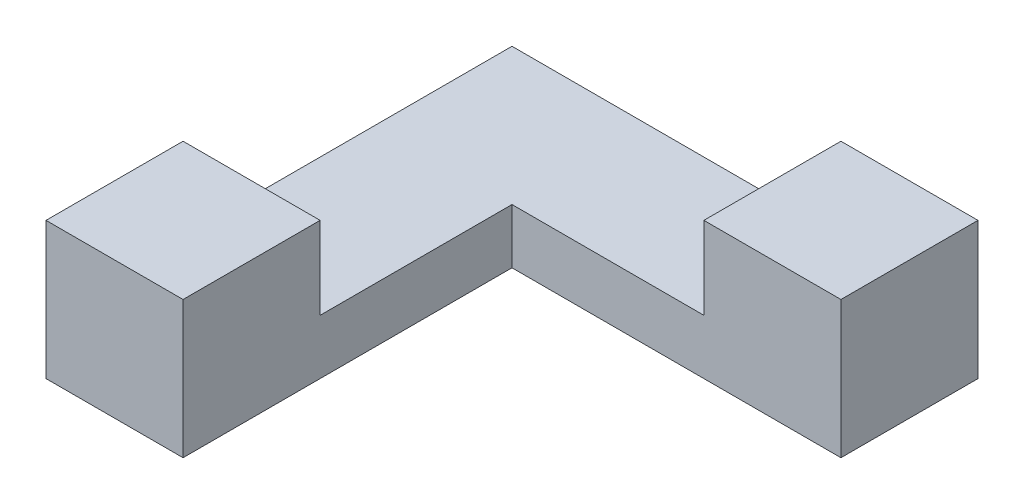
ISO-10303-21;
HEADER;
FILE_DESCRIPTION(('STEP AP214'),'2;1');
FILE_NAME('part.step','',(''),(''),'','','');
FILE_SCHEMA(('AUTOMOTIVE_DESIGN { 1 0 10303 214 1 1 1 1 }'));
ENDSEC;
DATA;
#1=APPLICATION_CONTEXT('core data for automotive mechanical design processes');
#2=APPLICATION_PROTOCOL_DEFINITION('international standard','automotive_design',2000,#1);
#3=PRODUCT_CONTEXT('',#1,'mechanical');
#4=PRODUCT('Part','Part','',(#3));
#5=PRODUCT_RELATED_PRODUCT_CATEGORY('part','',(#4));
#6=PRODUCT_DEFINITION_FORMATION('','',#4);
#7=PRODUCT_DEFINITION_CONTEXT('part definition',#1,'design');
#8=PRODUCT_DEFINITION('design','',#6,#7);
#9=PRODUCT_DEFINITION_SHAPE('','',#8);
#10=(LENGTH_UNIT() NAMED_UNIT(*) SI_UNIT(.MILLI.,.METRE.));
#11=(NAMED_UNIT(*) PLANE_ANGLE_UNIT() SI_UNIT($,.RADIAN.));
#12=(NAMED_UNIT(*) SI_UNIT($,.STERADIAN.) SOLID_ANGLE_UNIT());
#13=UNCERTAINTY_MEASURE_WITH_UNIT(LENGTH_MEASURE(1.E-05),#10,'distance_accuracy_value','');
#14=(GEOMETRIC_REPRESENTATION_CONTEXT(3) GLOBAL_UNCERTAINTY_ASSIGNED_CONTEXT((#13)) GLOBAL_UNIT_ASSIGNED_CONTEXT((#10,
#11,#12)) REPRESENTATION_CONTEXT('',''));
#15=CARTESIAN_POINT('',(0.,0.,0.));
#16=DIRECTION('',(0.,0.,1.));
#17=DIRECTION('',(1.,0.,0.));
#18=AXIS2_PLACEMENT_3D('',#15,#16,#17);
#19=CARTESIAN_POINT('',(0.,2.,0.));
#20=DIRECTION('',(-1.,0.,0.));
#21=DIRECTION('',(0.,0.,1.));
#22=AXIS2_PLACEMENT_3D('',#19,#20,#21);
#23=PLANE('',#22);
#24=DIRECTION('',(0.,0.,-1.));
#25=VECTOR('',#24,1.);
#26=CARTESIAN_POINT('',(0.,0.,0.));
#27=LINE('',#26,#25);
#28=CARTESIAN_POINT('',(0.,0.,5.));
#29=VERTEX_POINT('',#28);
#30=CARTESIAN_POINT('',(0.,0.,-7.));
#31=VERTEX_POINT('',#30);
#32=EDGE_CURVE('E64',#29,#31,#27,.T.);
#33=ORIENTED_EDGE('',*,*,#32,.T.);
#34=DIRECTION('',(0.,-1.,0.));
#35=VECTOR('',#34,1.);
#36=CARTESIAN_POINT('',(0.,2.,-7.));
#37=LINE('',#36,#35);
#38=CARTESIAN_POINT('',(0.,2.,-7.));
#39=VERTEX_POINT('',#38);
#40=EDGE_CURVE('E11',#39,#31,#37,.T.);
#41=ORIENTED_EDGE('',*,*,#40,.F.);
#42=DIRECTION('',(0.,0.,-1.));
#43=VECTOR('',#42,1.);
#44=CARTESIAN_POINT('',(0.,2.,0.));
#45=LINE('',#44,#43);
#46=CARTESIAN_POINT('',(0.,2.,0.));
#47=VERTEX_POINT('',#46);
#48=EDGE_CURVE('E86',#47,#39,#45,.T.);
#49=ORIENTED_EDGE('',*,*,#48,.F.);
#50=DIRECTION('',(0.,-1.,0.));
#51=VECTOR('',#50,1.);
#52=CARTESIAN_POINT('',(0.,5.,0.));
#53=LINE('',#52,#51);
#54=CARTESIAN_POINT('',(0.,5.,0.));
#55=VERTEX_POINT('',#54);
#56=EDGE_CURVE('E117',#55,#47,#53,.T.);
#57=ORIENTED_EDGE('',*,*,#56,.F.);
#58=DIRECTION('',(0.,0.,1.));
#59=VECTOR('',#58,1.);
#60=CARTESIAN_POINT('',(0.,5.,0.));
#61=LINE('',#60,#59);
#62=CARTESIAN_POINT('',(0.,5.,5.));
#63=VERTEX_POINT('',#62);
#64=EDGE_CURVE('E153',#55,#63,#61,.T.);
#65=ORIENTED_EDGE('',*,*,#64,.T.);
#66=DIRECTION('',(0.,-1.,0.));
#67=VECTOR('',#66,1.);
#68=CARTESIAN_POINT('',(0.,5.,5.));
#69=LINE('',#68,#67);
#70=EDGE_CURVE('E142',#63,#29,#69,.T.);
#71=ORIENTED_EDGE('',*,*,#70,.T.);
#72=EDGE_LOOP('',(#33,#41,#49,#57,#65,#71));
#73=FACE_BOUND('',#72,.T.);
#74=ADVANCED_FACE('F33',(#73),#23,.F.);
#75=CARTESIAN_POINT('',(0.,2.,-7.));
#76=DIRECTION('',(0.,0.,-1.));
#77=DIRECTION('',(-1.,0.,0.));
#78=AXIS2_PLACEMENT_3D('',#75,#76,#77);
#79=PLANE('',#78);
#80=DIRECTION('',(1.,0.,0.));
#81=VECTOR('',#80,1.);
#82=CARTESIAN_POINT('',(0.,0.,-7.));
#83=LINE('',#82,#81);
#84=CARTESIAN_POINT('',(12.,0.,-7.));
#85=VERTEX_POINT('',#84);
#86=EDGE_CURVE('E116',#31,#85,#83,.T.);
#87=ORIENTED_EDGE('',*,*,#86,.T.);
#88=DIRECTION('',(0.,-1.,0.));
#89=VECTOR('',#88,1.);
#90=CARTESIAN_POINT('',(12.,5.,-7.));
#91=LINE('',#90,#89);
#92=CARTESIAN_POINT('',(12.,5.,-7.));
#93=VERTEX_POINT('',#92);
#94=EDGE_CURVE('E172',#93,#85,#91,.T.);
#95=ORIENTED_EDGE('',*,*,#94,.F.);
#96=DIRECTION('',(-1.,0.,0.));
#97=VECTOR('',#96,1.);
#98=CARTESIAN_POINT('',(7.,5.,-7.));
#99=LINE('',#98,#97);
#100=CARTESIAN_POINT('',(7.,5.,-7.));
#101=VERTEX_POINT('',#100);
#102=EDGE_CURVE('E166',#93,#101,#99,.T.);
#103=ORIENTED_EDGE('',*,*,#102,.T.);
#104=DIRECTION('',(0.,-1.,0.));
#105=VECTOR('',#104,1.);
#106=CARTESIAN_POINT('',(7.,5.,-7.));
#107=LINE('',#106,#105);
#108=CARTESIAN_POINT('',(7.,2.,-7.));
#109=VERTEX_POINT('',#108);
#110=EDGE_CURVE('E99',#101,#109,#107,.T.);
#111=ORIENTED_EDGE('',*,*,#110,.T.);
#112=DIRECTION('',(1.,0.,0.));
#113=VECTOR('',#112,1.);
#114=CARTESIAN_POINT('',(0.,2.,-7.));
#115=LINE('',#114,#113);
#116=EDGE_CURVE('E90',#39,#109,#115,.T.);
#117=ORIENTED_EDGE('',*,*,#116,.F.);
#118=ORIENTED_EDGE('',*,*,#40,.T.);
#119=EDGE_LOOP('',(#87,#95,#103,#111,#117,#118));
#120=FACE_BOUND('',#119,.T.);
#121=ADVANCED_FACE('F96',(#120),#79,.F.);
#122=CARTESIAN_POINT('',(7.,2.,-12.));
#123=DIRECTION('',(0.,0.,1.));
#124=DIRECTION('',(1.,0.,0.));
#125=AXIS2_PLACEMENT_3D('',#122,#123,#124);
#126=PLANE('',#125);
#127=DIRECTION('',(-1.,0.,0.));
#128=VECTOR('',#127,1.);
#129=CARTESIAN_POINT('',(7.,0.,-12.));
#130=LINE('',#129,#128);
#131=CARTESIAN_POINT('',(12.,0.,-12.));
#132=VERTEX_POINT('',#131);
#133=CARTESIAN_POINT('',(-5.,0.,-12.));
#134=VERTEX_POINT('',#133);
#135=EDGE_CURVE('E119',#132,#134,#130,.T.);
#136=ORIENTED_EDGE('',*,*,#135,.T.);
#137=DIRECTION('',(0.,-1.,0.));
#138=VECTOR('',#137,1.);
#139=CARTESIAN_POINT('',(-5.,2.,-12.));
#140=LINE('',#139,#138);
#141=CARTESIAN_POINT('',(-5.,2.,-12.));
#142=VERTEX_POINT('',#141);
#143=EDGE_CURVE('E42',#142,#134,#140,.T.);
#144=ORIENTED_EDGE('',*,*,#143,.F.);
#145=DIRECTION('',(-1.,0.,0.));
#146=VECTOR('',#145,1.);
#147=CARTESIAN_POINT('',(7.,2.,-12.));
#148=LINE('',#147,#146);
#149=CARTESIAN_POINT('',(7.,2.,-12.));
#150=VERTEX_POINT('',#149);
#151=EDGE_CURVE('E51',#150,#142,#148,.T.);
#152=ORIENTED_EDGE('',*,*,#151,.F.);
#153=DIRECTION('',(0.,-1.,0.));
#154=VECTOR('',#153,1.);
#155=CARTESIAN_POINT('',(7.,5.,-12.));
#156=LINE('',#155,#154);
#157=CARTESIAN_POINT('',(7.,5.,-12.));
#158=VERTEX_POINT('',#157);
#159=EDGE_CURVE('E162',#158,#150,#156,.T.);
#160=ORIENTED_EDGE('',*,*,#159,.F.);
#161=DIRECTION('',(1.,0.,0.));
#162=VECTOR('',#161,1.);
#163=CARTESIAN_POINT('',(7.,5.,-12.));
#164=LINE('',#163,#162);
#165=CARTESIAN_POINT('',(12.,5.,-12.));
#166=VERTEX_POINT('',#165);
#167=EDGE_CURVE('E184',#158,#166,#164,.T.);
#168=ORIENTED_EDGE('',*,*,#167,.T.);
#169=DIRECTION('',(0.,-1.,0.));
#170=VECTOR('',#169,1.);
#171=CARTESIAN_POINT('',(12.,5.,-12.));
#172=LINE('',#171,#170);
#173=EDGE_CURVE('E165',#166,#132,#172,.T.);
#174=ORIENTED_EDGE('',*,*,#173,.T.);
#175=EDGE_LOOP('',(#136,#144,#152,#160,#168,#174));
#176=FACE_BOUND('',#175,.T.);
#177=ADVANCED_FACE('F213',(#176),#126,.F.);
#178=CARTESIAN_POINT('',(-5.,2.,-12.));
#179=DIRECTION('',(1.,0.,0.));
#180=DIRECTION('',(0.,0.,-1.));
#181=AXIS2_PLACEMENT_3D('',#178,#179,#180);
#182=PLANE('',#181);
#183=DIRECTION('',(0.,0.,1.));
#184=VECTOR('',#183,1.);
#185=CARTESIAN_POINT('',(-5.,0.,-12.));
#186=LINE('',#185,#184);
#187=CARTESIAN_POINT('',(-5.,0.,5.));
#188=VERTEX_POINT('',#187);
#189=EDGE_CURVE('E121',#134,#188,#186,.T.);
#190=ORIENTED_EDGE('',*,*,#189,.T.);
#191=DIRECTION('',(0.,-1.,0.));
#192=VECTOR('',#191,1.);
#193=CARTESIAN_POINT('',(-5.,5.,5.));
#194=LINE('',#193,#192);
#195=CARTESIAN_POINT('',(-5.,5.,5.));
#196=VERTEX_POINT('',#195);
#197=EDGE_CURVE('E139',#196,#188,#194,.T.);
#198=ORIENTED_EDGE('',*,*,#197,.F.);
#199=DIRECTION('',(0.,0.,-1.));
#200=VECTOR('',#199,1.);
#201=CARTESIAN_POINT('',(-5.,5.,0.));
#202=LINE('',#201,#200);
#203=CARTESIAN_POINT('',(-5.,5.,0.));
#204=VERTEX_POINT('',#203);
#205=EDGE_CURVE('E136',#196,#204,#202,.T.);
#206=ORIENTED_EDGE('',*,*,#205,.T.);
#207=DIRECTION('',(0.,-1.,0.));
#208=VECTOR('',#207,1.);
#209=CARTESIAN_POINT('',(-5.,5.,0.));
#210=LINE('',#209,#208);
#211=CARTESIAN_POINT('',(-5.,2.,0.));
#212=VERTEX_POINT('',#211);
#213=EDGE_CURVE('E133',#204,#212,#210,.T.);
#214=ORIENTED_EDGE('',*,*,#213,.T.);
#215=DIRECTION('',(0.,0.,1.));
#216=VECTOR('',#215,1.);
#217=CARTESIAN_POINT('',(-5.,2.,-12.));
#218=LINE('',#217,#216);
#219=EDGE_CURVE('E105',#142,#212,#218,.T.);
#220=ORIENTED_EDGE('',*,*,#219,.F.);
#221=ORIENTED_EDGE('',*,*,#143,.T.);
#222=EDGE_LOOP('',(#190,#198,#206,#214,#220,#221));
#223=FACE_BOUND('',#222,.T.);
#224=ADVANCED_FACE('F130',(#223),#182,.F.);
#225=CARTESIAN_POINT('',(0.,2.,0.));
#226=DIRECTION('',(0.,1.,0.));
#227=DIRECTION('',(0.,0.,1.));
#228=AXIS2_PLACEMENT_3D('',#225,#226,#227);
#229=PLANE('',#228);
#230=DIRECTION('',(1.,0.,0.));
#231=VECTOR('',#230,1.);
#232=CARTESIAN_POINT('',(-5.,2.,0.));
#233=LINE('',#232,#231);
#234=EDGE_CURVE('E74',#212,#47,#233,.T.);
#235=ORIENTED_EDGE('',*,*,#234,.T.);
#236=ORIENTED_EDGE('',*,*,#48,.T.);
#237=ORIENTED_EDGE('',*,*,#116,.T.);
#238=DIRECTION('',(0.,0.,-1.));
#239=VECTOR('',#238,1.);
#240=CARTESIAN_POINT('',(7.,2.,-7.));
#241=LINE('',#240,#239);
#242=EDGE_CURVE('E100',#109,#150,#241,.T.);
#243=ORIENTED_EDGE('',*,*,#242,.T.);
#244=ORIENTED_EDGE('',*,*,#151,.T.);
#245=ORIENTED_EDGE('',*,*,#219,.T.);
#246=EDGE_LOOP('',(#235,#236,#237,#243,#244,#245));
#247=FACE_BOUND('',#246,.T.);
#248=ADVANCED_FACE('F87',(#247),#229,.T.);
#249=CARTESIAN_POINT('',(0.,0.,0.));
#250=DIRECTION('',(0.,1.,0.));
#251=DIRECTION('',(0.,0.,1.));
#252=AXIS2_PLACEMENT_3D('',#249,#250,#251);
#253=PLANE('',#252);
#254=ORIENTED_EDGE('',*,*,#32,.F.);
#255=DIRECTION('',(-1.,0.,0.));
#256=VECTOR('',#255,1.);
#257=CARTESIAN_POINT('',(0.,0.,5.));
#258=LINE('',#257,#256);
#259=EDGE_CURVE('E150',#29,#188,#258,.T.);
#260=ORIENTED_EDGE('',*,*,#259,.T.);
#261=ORIENTED_EDGE('',*,*,#189,.F.);
#262=ORIENTED_EDGE('',*,*,#135,.F.);
#263=DIRECTION('',(0.,0.,1.));
#264=VECTOR('',#263,1.);
#265=CARTESIAN_POINT('',(12.,0.,-7.));
#266=LINE('',#265,#264);
#267=EDGE_CURVE('E176',#132,#85,#266,.T.);
#268=ORIENTED_EDGE('',*,*,#267,.T.);
#269=ORIENTED_EDGE('',*,*,#86,.F.);
#270=EDGE_LOOP('',(#254,#260,#261,#262,#268,#269));
#271=FACE_BOUND('',#270,.T.);
#272=ADVANCED_FACE('F217',(#271),#253,.F.);
#273=CARTESIAN_POINT('',(0.,5.,0.));
#274=DIRECTION('',(0.,0.,-1.));
#275=DIRECTION('',(-1.,0.,0.));
#276=AXIS2_PLACEMENT_3D('',#273,#274,#275);
#277=PLANE('',#276);
#278=ORIENTED_EDGE('',*,*,#234,.F.);
#279=ORIENTED_EDGE('',*,*,#213,.F.);
#280=DIRECTION('',(1.,0.,0.));
#281=VECTOR('',#280,1.);
#282=CARTESIAN_POINT('',(0.,5.,0.));
#283=LINE('',#282,#281);
#284=EDGE_CURVE('E154',#204,#55,#283,.T.);
#285=ORIENTED_EDGE('',*,*,#284,.T.);
#286=ORIENTED_EDGE('',*,*,#56,.T.);
#287=EDGE_LOOP('',(#278,#279,#285,#286));
#288=FACE_BOUND('',#287,.T.);
#289=ADVANCED_FACE('F235',(#288),#277,.T.);
#290=CARTESIAN_POINT('',(0.,5.,5.));
#291=DIRECTION('',(0.,0.,1.));
#292=DIRECTION('',(1.,0.,0.));
#293=AXIS2_PLACEMENT_3D('',#290,#291,#292);
#294=PLANE('',#293);
#295=ORIENTED_EDGE('',*,*,#259,.F.);
#296=ORIENTED_EDGE('',*,*,#70,.F.);
#297=DIRECTION('',(-1.,0.,0.));
#298=VECTOR('',#297,1.);
#299=CARTESIAN_POINT('',(0.,5.,5.));
#300=LINE('',#299,#298);
#301=EDGE_CURVE('E157',#63,#196,#300,.T.);
#302=ORIENTED_EDGE('',*,*,#301,.T.);
#303=ORIENTED_EDGE('',*,*,#197,.T.);
#304=EDGE_LOOP('',(#295,#296,#302,#303));
#305=FACE_BOUND('',#304,.T.);
#306=ADVANCED_FACE('F230',(#305),#294,.T.);
#307=CARTESIAN_POINT('',(0.,5.,0.));
#308=DIRECTION('',(0.,-1.,0.));
#309=DIRECTION('',(0.,0.,-1.));
#310=AXIS2_PLACEMENT_3D('',#307,#308,#309);
#311=PLANE('',#310);
#312=ORIENTED_EDGE('',*,*,#64,.F.);
#313=ORIENTED_EDGE('',*,*,#284,.F.);
#314=ORIENTED_EDGE('',*,*,#205,.F.);
#315=ORIENTED_EDGE('',*,*,#301,.F.);
#316=EDGE_LOOP('',(#312,#313,#314,#315));
#317=FACE_BOUND('',#316,.T.);
#318=ADVANCED_FACE('F234',(#317),#311,.F.);
#319=CARTESIAN_POINT('',(7.,5.,-7.));
#320=DIRECTION('',(-1.,0.,0.));
#321=DIRECTION('',(0.,0.,1.));
#322=AXIS2_PLACEMENT_3D('',#319,#320,#321);
#323=PLANE('',#322);
#324=ORIENTED_EDGE('',*,*,#242,.F.);
#325=ORIENTED_EDGE('',*,*,#110,.F.);
#326=DIRECTION('',(0.,0.,-1.));
#327=VECTOR('',#326,1.);
#328=CARTESIAN_POINT('',(7.,5.,-7.));
#329=LINE('',#328,#327);
#330=EDGE_CURVE('E179',#101,#158,#329,.T.);
#331=ORIENTED_EDGE('',*,*,#330,.T.);
#332=ORIENTED_EDGE('',*,*,#159,.T.);
#333=EDGE_LOOP('',(#324,#325,#331,#332));
#334=FACE_BOUND('',#333,.T.);
#335=ADVANCED_FACE('F192',(#334),#323,.T.);
#336=CARTESIAN_POINT('',(12.,5.,-7.));
#337=DIRECTION('',(1.,0.,0.));
#338=DIRECTION('',(0.,0.,-1.));
#339=AXIS2_PLACEMENT_3D('',#336,#337,#338);
#340=PLANE('',#339);
#341=ORIENTED_EDGE('',*,*,#267,.F.);
#342=ORIENTED_EDGE('',*,*,#173,.F.);
#343=DIRECTION('',(0.,0.,1.));
#344=VECTOR('',#343,1.);
#345=CARTESIAN_POINT('',(12.,5.,-7.));
#346=LINE('',#345,#344);
#347=EDGE_CURVE('E181',#166,#93,#346,.T.);
#348=ORIENTED_EDGE('',*,*,#347,.T.);
#349=ORIENTED_EDGE('',*,*,#94,.T.);
#350=EDGE_LOOP('',(#341,#342,#348,#349));
#351=FACE_BOUND('',#350,.T.);
#352=ADVANCED_FACE('F210',(#351),#340,.T.);
#353=CARTESIAN_POINT('',(0.,5.,0.));
#354=DIRECTION('',(0.,-1.,0.));
#355=DIRECTION('',(0.,0.,-1.));
#356=AXIS2_PLACEMENT_3D('',#353,#354,#355);
#357=PLANE('',#356);
#358=ORIENTED_EDGE('',*,*,#330,.F.);
#359=ORIENTED_EDGE('',*,*,#102,.F.);
#360=ORIENTED_EDGE('',*,*,#347,.F.);
#361=ORIENTED_EDGE('',*,*,#167,.F.);
#362=EDGE_LOOP('',(#358,#359,#360,#361));
#363=FACE_BOUND('',#362,.T.);
#364=ADVANCED_FACE('F201',(#363),#357,.F.);
#365=CLOSED_SHELL('',(#74,#121,#177,#224,#248,#272,#289,#306,#318,#335,#352,#364));
#366=MANIFOLD_SOLID_BREP('B2',#365);
#367=ADVANCED_BREP_SHAPE_REPRESENTATION('',(#18,#366),#14);
#368=SHAPE_DEFINITION_REPRESENTATION(#9,#367);
ENDSEC;
END-ISO-10303-21;
